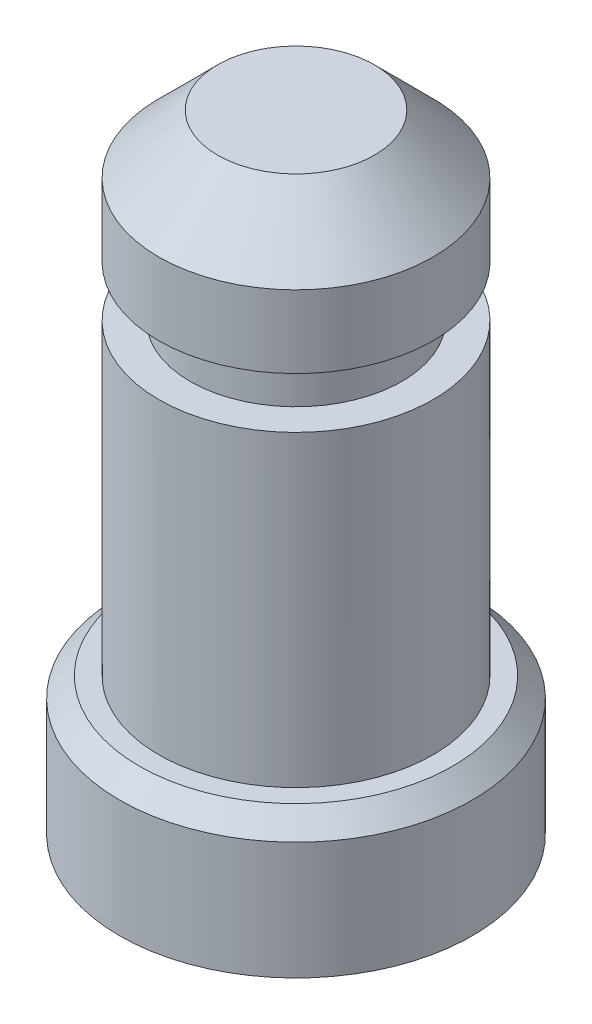
ISO-10303-21;
HEADER;
FILE_DESCRIPTION(('STEP AP214'),'2;1');
FILE_NAME('part.step','',(''),(''),'','','');
FILE_SCHEMA(('AUTOMOTIVE_DESIGN { 1 0 10303 214 1 1 1 1 }'));
ENDSEC;
DATA;
#1=APPLICATION_CONTEXT('core data for automotive mechanical design processes');
#2=APPLICATION_PROTOCOL_DEFINITION('international standard','automotive_design',2000,#1);
#3=PRODUCT_CONTEXT('',#1,'mechanical');
#4=PRODUCT('Part','Part','',(#3));
#5=PRODUCT_RELATED_PRODUCT_CATEGORY('part','',(#4));
#6=PRODUCT_DEFINITION_FORMATION('','',#4);
#7=PRODUCT_DEFINITION_CONTEXT('part definition',#1,'design');
#8=PRODUCT_DEFINITION('design','',#6,#7);
#9=PRODUCT_DEFINITION_SHAPE('','',#8);
#10=(LENGTH_UNIT() NAMED_UNIT(*) SI_UNIT(.MILLI.,.METRE.));
#11=(NAMED_UNIT(*) PLANE_ANGLE_UNIT() SI_UNIT($,.RADIAN.));
#12=(NAMED_UNIT(*) SI_UNIT($,.STERADIAN.) SOLID_ANGLE_UNIT());
#13=UNCERTAINTY_MEASURE_WITH_UNIT(LENGTH_MEASURE(1.E-05),#10,'distance_accuracy_value','');
#14=(GEOMETRIC_REPRESENTATION_CONTEXT(3) GLOBAL_UNCERTAINTY_ASSIGNED_CONTEXT((#13)) GLOBAL_UNIT_ASSIGNED_CONTEXT((#10,
#11,#12)) REPRESENTATION_CONTEXT('',''));
#15=CARTESIAN_POINT('',(0.,0.,0.));
#16=DIRECTION('',(0.,0.,1.));
#17=DIRECTION('',(1.,0.,0.));
#18=AXIS2_PLACEMENT_3D('',#15,#16,#17);
#19=CARTESIAN_POINT('',(0.,8.,0.));
#20=DIRECTION('',(0.,-1.,0.));
#21=DIRECTION('',(0.,0.,-1.));
#22=AXIS2_PLACEMENT_3D('',#19,#20,#21);
#23=CYLINDRICAL_SURFACE('',#22,3.5);
#24=CARTESIAN_POINT('',(0.,-4.5,0.));
#25=DIRECTION('',(0.,-1.,0.));
#26=DIRECTION('',(0.,0.,-1.));
#27=AXIS2_PLACEMENT_3D('',#24,#25,#26);
#28=CIRCLE('',#27,3.5);
#29=CARTESIAN_POINT('',(0.,-4.5,-3.5));
#30=VERTEX_POINT('',#29);
#31=EDGE_CURVE('E60',#30,#30,#28,.T.);
#32=ORIENTED_EDGE('',*,*,#31,.F.);
#33=EDGE_LOOP('',(#32));
#34=FACE_BOUND('',#33,.T.);
#35=CARTESIAN_POINT('',(0.,3.35,0.));
#36=DIRECTION('',(0.,1.,0.));
#37=DIRECTION('',(0.,0.,1.));
#38=AXIS2_PLACEMENT_3D('',#35,#36,#37);
#39=CIRCLE('',#38,3.5);
#40=CARTESIAN_POINT('',(0.,3.35,3.5));
#41=VERTEX_POINT('',#40);
#42=EDGE_CURVE('E63',#41,#41,#39,.T.);
#43=ORIENTED_EDGE('',*,*,#42,.F.);
#44=EDGE_LOOP('',(#43));
#45=FACE_BOUND('',#44,.T.);
#46=ADVANCED_FACE('F36',(#34,#45),#23,.T.);
#47=CARTESIAN_POINT('',(0.,8.,0.));
#48=DIRECTION('',(0.,1.,0.));
#49=DIRECTION('',(0.,0.,1.));
#50=AXIS2_PLACEMENT_3D('',#47,#48,#49);
#51=CYLINDRICAL_SURFACE('',#50,4.5);
#52=CARTESIAN_POINT('',(0.,-5.00000000000001,0.));
#53=DIRECTION('',(0.,-1.,0.));
#54=DIRECTION('',(0.,0.,-1.));
#55=AXIS2_PLACEMENT_3D('',#52,#53,#54);
#56=CIRCLE('',#55,4.5);
#57=CARTESIAN_POINT('',(0.,-5.00000000000001,-4.5));
#58=VERTEX_POINT('',#57);
#59=EDGE_CURVE('E11',#58,#58,#56,.T.);
#60=ORIENTED_EDGE('',*,*,#59,.T.);
#61=EDGE_LOOP('',(#60));
#62=FACE_BOUND('',#61,.T.);
#63=CARTESIAN_POINT('',(0.,-8.,0.));
#64=DIRECTION('',(0.,1.,0.));
#65=DIRECTION('',(0.,0.,1.));
#66=AXIS2_PLACEMENT_3D('',#63,#64,#65);
#67=CIRCLE('',#66,4.5);
#68=CARTESIAN_POINT('',(0.,-8.,4.5));
#69=VERTEX_POINT('',#68);
#70=EDGE_CURVE('E56',#69,#69,#67,.T.);
#71=ORIENTED_EDGE('',*,*,#70,.T.);
#72=EDGE_LOOP('',(#71));
#73=FACE_BOUND('',#72,.T.);
#74=ADVANCED_FACE('F91',(#62,#73),#51,.T.);
#75=CARTESIAN_POINT('',(4.5,-4.5,0.));
#76=DIRECTION('',(0.,-1.,0.));
#77=DIRECTION('',(0.,0.,-1.));
#78=AXIS2_PLACEMENT_3D('',#75,#76,#77);
#79=PLANE('',#78);
#80=CARTESIAN_POINT('',(0.,-4.5,0.));
#81=DIRECTION('',(0.,-1.,0.));
#82=DIRECTION('',(0.,0.,-1.));
#83=AXIS2_PLACEMENT_3D('',#80,#81,#82);
#84=CIRCLE('',#83,4.);
#85=CARTESIAN_POINT('',(0.,-4.5,-4.));
#86=VERTEX_POINT('',#85);
#87=EDGE_CURVE('E43',#86,#86,#84,.F.);
#88=ORIENTED_EDGE('',*,*,#87,.T.);
#89=EDGE_LOOP('',(#88));
#90=FACE_BOUND('',#89,.T.);
#91=ORIENTED_EDGE('',*,*,#31,.T.);
#92=EDGE_LOOP('',(#91));
#93=FACE_BOUND('',#92,.T.);
#94=ADVANCED_FACE('F77',(#90,#93),#79,.F.);
#95=CARTESIAN_POINT('',(0.,-8.,0.));
#96=DIRECTION('',(0.,1.,0.));
#97=DIRECTION('',(0.,0.,1.));
#98=AXIS2_PLACEMENT_3D('',#95,#96,#97);
#99=PLANE('',#98);
#100=CARTESIAN_POINT('',(0.,-8.,0.));
#101=DIRECTION('',(0.,-1.,0.));
#102=DIRECTION('',(0.,0.,-1.));
#103=AXIS2_PLACEMENT_3D('',#100,#101,#102);
#104=CIRCLE('',#103,1.65);
#105=CARTESIAN_POINT('',(0.,-8.,-1.65));
#106=VERTEX_POINT('',#105);
#107=EDGE_CURVE('E57',#106,#106,#104,.T.);
#108=ORIENTED_EDGE('',*,*,#107,.F.);
#109=EDGE_LOOP('',(#108));
#110=FACE_BOUND('',#109,.T.);
#111=ORIENTED_EDGE('',*,*,#70,.F.);
#112=EDGE_LOOP('',(#111));
#113=FACE_BOUND('',#112,.T.);
#114=ADVANCED_FACE('F50',(#110,#113),#99,.F.);
#115=CARTESIAN_POINT('',(0.,2.1,0.));
#116=DIRECTION('',(0.,-1.,0.));
#117=DIRECTION('',(0.,0.,-1.));
#118=AXIS2_PLACEMENT_3D('',#115,#116,#117);
#119=CONICAL_SURFACE('',#118,1.65,1.02974425867665);
#120=CARTESIAN_POINT('',(0.,3.09142002139548,0.));
#121=VERTEX_POINT('',#120);
#122=VERTEX_LOOP('',#121);
#123=FACE_BOUND('',#122,.T.);
#124=CARTESIAN_POINT('',(0.,2.1,0.));
#125=DIRECTION('',(0.,-1.,0.));
#126=DIRECTION('',(0.,0.,-1.));
#127=AXIS2_PLACEMENT_3D('',#124,#125,#126);
#128=CIRCLE('',#127,1.65);
#129=CARTESIAN_POINT('',(0.,2.1,-1.65));
#130=VERTEX_POINT('',#129);
#131=EDGE_CURVE('E54',#130,#130,#128,.T.);
#132=ORIENTED_EDGE('',*,*,#131,.T.);
#133=EDGE_LOOP('',(#132));
#134=FACE_BOUND('',#133,.T.);
#135=ADVANCED_FACE('F46',(#123,#134),#119,.F.);
#136=CARTESIAN_POINT('',(0.,-8.,0.));
#137=DIRECTION('',(0.,-1.,0.));
#138=DIRECTION('',(0.,0.,-1.));
#139=AXIS2_PLACEMENT_3D('',#136,#137,#138);
#140=CYLINDRICAL_SURFACE('',#139,1.65);
#141=ORIENTED_EDGE('',*,*,#131,.F.);
#142=EDGE_LOOP('',(#141));
#143=FACE_BOUND('',#142,.T.);
#144=ORIENTED_EDGE('',*,*,#107,.T.);
#145=EDGE_LOOP('',(#144));
#146=FACE_BOUND('',#145,.T.);
#147=ADVANCED_FACE('F49',(#143,#146),#140,.F.);
#148=CARTESIAN_POINT('',(2.7,3.35,0.));
#149=DIRECTION('',(0.,1.,0.));
#150=DIRECTION('',(0.,0.,1.));
#151=AXIS2_PLACEMENT_3D('',#148,#149,#150);
#152=PLANE('',#151);
#153=ORIENTED_EDGE('',*,*,#42,.T.);
#154=EDGE_LOOP('',(#153));
#155=FACE_BOUND('',#154,.T.);
#156=CARTESIAN_POINT('',(0.,3.35,0.));
#157=DIRECTION('',(0.,1.,0.));
#158=DIRECTION('',(0.,0.,1.));
#159=AXIS2_PLACEMENT_3D('',#156,#157,#158);
#160=CIRCLE('',#159,2.7);
#161=CARTESIAN_POINT('',(0.,3.35,2.7));
#162=VERTEX_POINT('',#161);
#163=EDGE_CURVE('E122',#162,#162,#160,.T.);
#164=ORIENTED_EDGE('',*,*,#163,.F.);
#165=EDGE_LOOP('',(#164));
#166=FACE_BOUND('',#165,.T.);
#167=ADVANCED_FACE('F130',(#155,#166),#152,.T.);
#168=CARTESIAN_POINT('',(3.5,4.65,0.));
#169=DIRECTION('',(0.,-1.,0.));
#170=DIRECTION('',(0.,0.,-1.));
#171=AXIS2_PLACEMENT_3D('',#168,#169,#170);
#172=PLANE('',#171);
#173=CARTESIAN_POINT('',(0.,4.65,0.));
#174=DIRECTION('',(0.,1.,0.));
#175=DIRECTION('',(0.,0.,1.));
#176=AXIS2_PLACEMENT_3D('',#173,#174,#175);
#177=CIRCLE('',#176,2.7);
#178=CARTESIAN_POINT('',(0.,4.65,2.7));
#179=VERTEX_POINT('',#178);
#180=EDGE_CURVE('E118',#179,#179,#177,.T.);
#181=ORIENTED_EDGE('',*,*,#180,.T.);
#182=EDGE_LOOP('',(#181));
#183=FACE_BOUND('',#182,.T.);
#184=CARTESIAN_POINT('',(0.,4.65,0.));
#185=DIRECTION('',(0.,1.,0.));
#186=DIRECTION('',(0.,0.,1.));
#187=AXIS2_PLACEMENT_3D('',#184,#185,#186);
#188=CIRCLE('',#187,3.5);
#189=CARTESIAN_POINT('',(0.,4.65,3.5));
#190=VERTEX_POINT('',#189);
#191=EDGE_CURVE('E116',#190,#190,#188,.T.);
#192=ORIENTED_EDGE('',*,*,#191,.F.);
#193=EDGE_LOOP('',(#192));
#194=FACE_BOUND('',#193,.T.);
#195=ADVANCED_FACE('F132',(#183,#194),#172,.T.);
#196=CARTESIAN_POINT('',(0.,6.5,0.));
#197=DIRECTION('',(0.,1.,0.));
#198=DIRECTION('',(0.,0.,1.));
#199=AXIS2_PLACEMENT_3D('',#196,#197,#198);
#200=CYLINDRICAL_SURFACE('',#199,2.7);
#201=ORIENTED_EDGE('',*,*,#163,.T.);
#202=EDGE_LOOP('',(#201));
#203=FACE_BOUND('',#202,.T.);
#204=ORIENTED_EDGE('',*,*,#180,.F.);
#205=EDGE_LOOP('',(#204));
#206=FACE_BOUND('',#205,.T.);
#207=ADVANCED_FACE('F108',(#203,#206),#200,.T.);
#208=CARTESIAN_POINT('',(0.,8.,0.));
#209=DIRECTION('',(0.,1.,0.));
#210=DIRECTION('',(0.,0.,1.));
#211=AXIS2_PLACEMENT_3D('',#208,#209,#210);
#212=PLANE('',#211);
#213=CARTESIAN_POINT('',(0.,8.,0.));
#214=DIRECTION('',(0.,1.,0.));
#215=DIRECTION('',(0.,0.,1.));
#216=AXIS2_PLACEMENT_3D('',#213,#214,#215);
#217=CIRCLE('',#216,2.00000000000001);
#218=CARTESIAN_POINT('',(0.,8.,2.00000000000001));
#219=VERTEX_POINT('',#218);
#220=EDGE_CURVE('E69',#219,#219,#217,.T.);
#221=ORIENTED_EDGE('',*,*,#220,.T.);
#222=EDGE_LOOP('',(#221));
#223=FACE_BOUND('',#222,.T.);
#224=ADVANCED_FACE('F103',(#223),#212,.T.);
#225=CARTESIAN_POINT('',(0.,8.,0.));
#226=DIRECTION('',(0.,-1.,0.));
#227=DIRECTION('',(0.,0.,-1.));
#228=AXIS2_PLACEMENT_3D('',#225,#226,#227);
#229=CONICAL_SURFACE('',#228,2.00000000000001,0.785398163397447);
#230=CARTESIAN_POINT('',(0.,6.5,0.));
#231=DIRECTION('',(0.,1.,0.));
#232=DIRECTION('',(0.,0.,1.));
#233=AXIS2_PLACEMENT_3D('',#230,#231,#232);
#234=CIRCLE('',#233,3.5);
#235=CARTESIAN_POINT('',(0.,6.5,3.5));
#236=VERTEX_POINT('',#235);
#237=EDGE_CURVE('E72',#236,#236,#234,.F.);
#238=ORIENTED_EDGE('',*,*,#237,.F.);
#239=EDGE_LOOP('',(#238));
#240=FACE_BOUND('',#239,.T.);
#241=ORIENTED_EDGE('',*,*,#220,.F.);
#242=EDGE_LOOP('',(#241));
#243=FACE_BOUND('',#242,.T.);
#244=ADVANCED_FACE('F86',(#240,#243),#229,.T.);
#245=ORIENTED_EDGE('',*,*,#237,.T.);
#246=EDGE_LOOP('',(#245));
#247=FACE_BOUND('',#246,.T.);
#248=ORIENTED_EDGE('',*,*,#191,.T.);
#249=EDGE_LOOP('',(#248));
#250=FACE_BOUND('',#249,.T.);
#251=ADVANCED_FACE('F81',(#247,#250),#23,.T.);
#252=CARTESIAN_POINT('',(0.,-4.5,0.));
#253=DIRECTION('',(0.,-1.,0.));
#254=DIRECTION('',(0.,0.,-1.));
#255=AXIS2_PLACEMENT_3D('',#252,#253,#254);
#256=CONICAL_SURFACE('',#255,4.,0.785398163397443);
#257=ORIENTED_EDGE('',*,*,#59,.F.);
#258=EDGE_LOOP('',(#257));
#259=FACE_BOUND('',#258,.T.);
#260=ORIENTED_EDGE('',*,*,#87,.F.);
#261=EDGE_LOOP('',(#260));
#262=FACE_BOUND('',#261,.T.);
#263=ADVANCED_FACE('F38',(#259,#262),#256,.T.);
#264=CLOSED_SHELL('',(#46,#74,#94,#114,#135,#147,#167,#195,#207,#224,#244,#251,#263));
#265=MANIFOLD_SOLID_BREP('B2',#264);
#266=ADVANCED_BREP_SHAPE_REPRESENTATION('',(#18,#265),#14);
#267=SHAPE_DEFINITION_REPRESENTATION(#9,#266);
ENDSEC;
END-ISO-10303-21;
